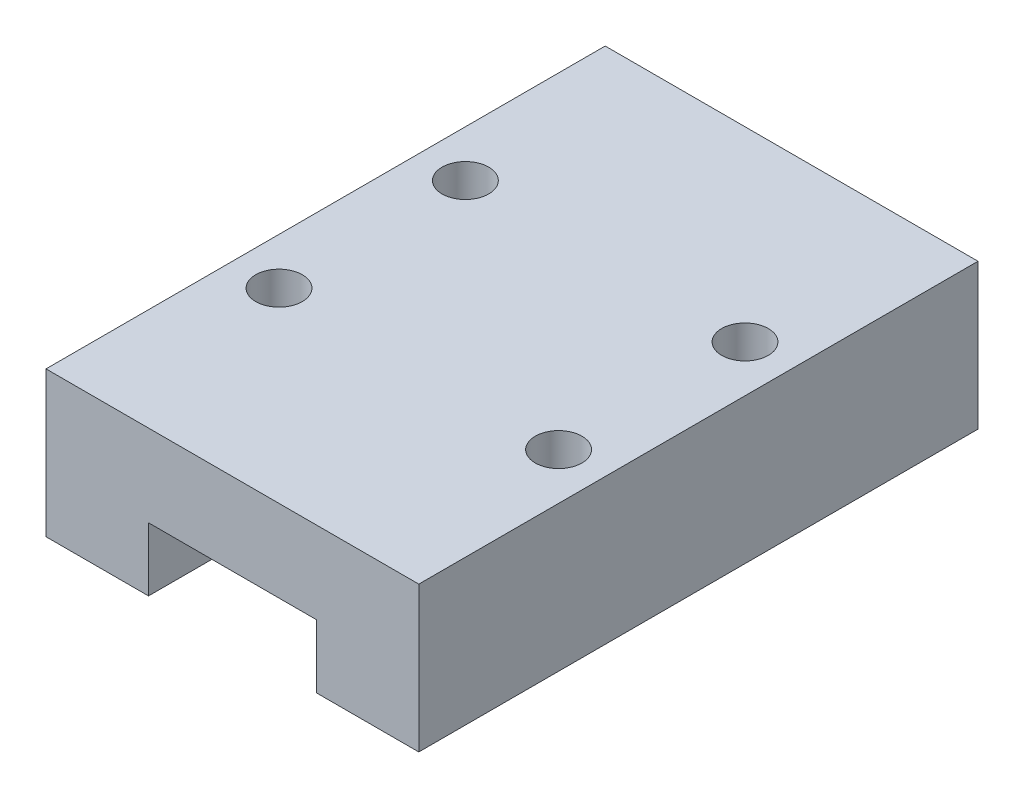
ISO-10303-21;
HEADER;
FILE_DESCRIPTION(('STEP AP214'),'2;1');
FILE_NAME('part.step','',(''),(''),'','','');
FILE_SCHEMA(('AUTOMOTIVE_DESIGN { 1 0 10303 214 1 1 1 1 }'));
ENDSEC;
DATA;
#1=APPLICATION_CONTEXT('core data for automotive mechanical design processes');
#2=APPLICATION_PROTOCOL_DEFINITION('international standard','automotive_design',2000,#1);
#3=PRODUCT_CONTEXT('',#1,'mechanical');
#4=PRODUCT('Part','Part','',(#3));
#5=PRODUCT_RELATED_PRODUCT_CATEGORY('part','',(#4));
#6=PRODUCT_DEFINITION_FORMATION('','',#4);
#7=PRODUCT_DEFINITION_CONTEXT('part definition',#1,'design');
#8=PRODUCT_DEFINITION('design','',#6,#7);
#9=PRODUCT_DEFINITION_SHAPE('','',#8);
#10=(LENGTH_UNIT() NAMED_UNIT(*) SI_UNIT(.MILLI.,.METRE.));
#11=(NAMED_UNIT(*) PLANE_ANGLE_UNIT() SI_UNIT($,.RADIAN.));
#12=(NAMED_UNIT(*) SI_UNIT($,.STERADIAN.) SOLID_ANGLE_UNIT());
#13=UNCERTAINTY_MEASURE_WITH_UNIT(LENGTH_MEASURE(1.E-05),#10,'distance_accuracy_value','');
#14=(GEOMETRIC_REPRESENTATION_CONTEXT(3) GLOBAL_UNCERTAINTY_ASSIGNED_CONTEXT((#13)) GLOBAL_UNIT_ASSIGNED_CONTEXT((#10,
#11,#12)) REPRESENTATION_CONTEXT('',''));
#15=CARTESIAN_POINT('',(0.,0.,0.));
#16=DIRECTION('',(0.,0.,1.));
#17=DIRECTION('',(1.,0.,0.));
#18=AXIS2_PLACEMENT_3D('',#15,#16,#17);
#19=CARTESIAN_POINT('',(5.5,0.,30.));
#20=DIRECTION('',(0.,1.,0.));
#21=DIRECTION('',(0.,0.,1.));
#22=AXIS2_PLACEMENT_3D('',#19,#20,#21);
#23=PLANE('',#22);
#24=DIRECTION('',(1.,0.,0.));
#25=VECTOR('',#24,1.);
#26=CARTESIAN_POINT('',(5.5,0.,0.));
#27=LINE('',#26,#25);
#28=CARTESIAN_POINT('',(0.,0.,0.));
#29=VERTEX_POINT('',#28);
#30=CARTESIAN_POINT('',(5.5,0.,0.));
#31=VERTEX_POINT('',#30);
#32=EDGE_CURVE('E128',#29,#31,#27,.T.);
#33=ORIENTED_EDGE('',*,*,#32,.T.);
#34=DIRECTION('',(0.,0.,-1.));
#35=VECTOR('',#34,1.);
#36=CARTESIAN_POINT('',(5.5,0.,30.));
#37=LINE('',#36,#35);
#38=CARTESIAN_POINT('',(5.5,0.,30.));
#39=VERTEX_POINT('',#38);
#40=EDGE_CURVE('E11',#39,#31,#37,.T.);
#41=ORIENTED_EDGE('',*,*,#40,.F.);
#42=DIRECTION('',(1.,0.,0.));
#43=VECTOR('',#42,1.);
#44=CARTESIAN_POINT('',(5.5,0.,30.));
#45=LINE('',#44,#43);
#46=CARTESIAN_POINT('',(0.,0.,30.));
#47=VERTEX_POINT('',#46);
#48=EDGE_CURVE('E143',#47,#39,#45,.T.);
#49=ORIENTED_EDGE('',*,*,#48,.F.);
#50=DIRECTION('',(0.,0.,-1.));
#51=VECTOR('',#50,1.);
#52=CARTESIAN_POINT('',(0.,0.,30.));
#53=LINE('',#52,#51);
#54=EDGE_CURVE('E124',#47,#29,#53,.T.);
#55=ORIENTED_EDGE('',*,*,#54,.T.);
#56=EDGE_LOOP('',(#33,#41,#49,#55));
#57=FACE_BOUND('',#56,.T.);
#58=ADVANCED_FACE('F32',(#57),#23,.F.);
#59=CARTESIAN_POINT('',(5.5,3.4,30.));
#60=DIRECTION('',(-1.,0.,0.));
#61=DIRECTION('',(0.,-1.,0.));
#62=AXIS2_PLACEMENT_3D('',#59,#60,#61);
#63=PLANE('',#62);
#64=DIRECTION('',(0.,1.,0.));
#65=VECTOR('',#64,1.);
#66=CARTESIAN_POINT('',(5.5,3.4,0.));
#67=LINE('',#66,#65);
#68=CARTESIAN_POINT('',(5.5,3.4,0.));
#69=VERTEX_POINT('',#68);
#70=EDGE_CURVE('E131',#31,#69,#67,.T.);
#71=ORIENTED_EDGE('',*,*,#70,.T.);
#72=DIRECTION('',(0.,0.,-1.));
#73=VECTOR('',#72,1.);
#74=CARTESIAN_POINT('',(5.5,3.4,30.));
#75=LINE('',#74,#73);
#76=CARTESIAN_POINT('',(5.5,3.4,30.));
#77=VERTEX_POINT('',#76);
#78=EDGE_CURVE('E40',#77,#69,#75,.T.);
#79=ORIENTED_EDGE('',*,*,#78,.F.);
#80=DIRECTION('',(0.,1.,0.));
#81=VECTOR('',#80,1.);
#82=CARTESIAN_POINT('',(5.5,3.4,30.));
#83=LINE('',#82,#81);
#84=EDGE_CURVE('E91',#39,#77,#83,.T.);
#85=ORIENTED_EDGE('',*,*,#84,.F.);
#86=ORIENTED_EDGE('',*,*,#40,.T.);
#87=EDGE_LOOP('',(#71,#79,#85,#86));
#88=FACE_BOUND('',#87,.T.);
#89=ADVANCED_FACE('F235',(#88),#63,.F.);
#90=CARTESIAN_POINT('',(14.5,3.4,30.));
#91=DIRECTION('',(0.,1.,0.));
#92=DIRECTION('',(-1.,0.,0.));
#93=AXIS2_PLACEMENT_3D('',#90,#91,#92);
#94=PLANE('',#93);
#95=DIRECTION('',(1.,0.,0.));
#96=VECTOR('',#95,1.);
#97=CARTESIAN_POINT('',(14.5,3.4,0.));
#98=LINE('',#97,#96);
#99=CARTESIAN_POINT('',(14.5,3.4,0.));
#100=VERTEX_POINT('',#99);
#101=EDGE_CURVE('E134',#69,#100,#98,.T.);
#102=ORIENTED_EDGE('',*,*,#101,.T.);
#103=DIRECTION('',(0.,0.,-1.));
#104=VECTOR('',#103,1.);
#105=CARTESIAN_POINT('',(14.5,3.4,30.));
#106=LINE('',#105,#104);
#107=CARTESIAN_POINT('',(14.5,3.4,30.));
#108=VERTEX_POINT('',#107);
#109=EDGE_CURVE('E150',#108,#100,#106,.T.);
#110=ORIENTED_EDGE('',*,*,#109,.F.);
#111=DIRECTION('',(1.,0.,0.));
#112=VECTOR('',#111,1.);
#113=CARTESIAN_POINT('',(14.5,3.4,30.));
#114=LINE('',#113,#112);
#115=EDGE_CURVE('E158',#77,#108,#114,.T.);
#116=ORIENTED_EDGE('',*,*,#115,.F.);
#117=ORIENTED_EDGE('',*,*,#78,.T.);
#118=EDGE_LOOP('',(#102,#110,#116,#117));
#119=FACE_BOUND('',#118,.T.);
#120=ADVANCED_FACE('F156',(#119),#94,.F.);
#121=CARTESIAN_POINT('',(14.5,0.,30.));
#122=DIRECTION('',(1.,0.,0.));
#123=DIRECTION('',(0.,1.,0.));
#124=AXIS2_PLACEMENT_3D('',#121,#122,#123);
#125=PLANE('',#124);
#126=DIRECTION('',(0.,-1.,0.));
#127=VECTOR('',#126,1.);
#128=CARTESIAN_POINT('',(14.5,0.,0.));
#129=LINE('',#128,#127);
#130=CARTESIAN_POINT('',(14.5,0.,0.));
#131=VERTEX_POINT('',#130);
#132=EDGE_CURVE('E136',#100,#131,#129,.T.);
#133=ORIENTED_EDGE('',*,*,#132,.T.);
#134=DIRECTION('',(0.,0.,-1.));
#135=VECTOR('',#134,1.);
#136=CARTESIAN_POINT('',(14.5,0.,30.));
#137=LINE('',#136,#135);
#138=CARTESIAN_POINT('',(14.5,0.,30.));
#139=VERTEX_POINT('',#138);
#140=EDGE_CURVE('E147',#139,#131,#137,.T.);
#141=ORIENTED_EDGE('',*,*,#140,.F.);
#142=DIRECTION('',(0.,-1.,0.));
#143=VECTOR('',#142,1.);
#144=CARTESIAN_POINT('',(14.5,0.,30.));
#145=LINE('',#144,#143);
#146=EDGE_CURVE('E170',#108,#139,#145,.T.);
#147=ORIENTED_EDGE('',*,*,#146,.F.);
#148=ORIENTED_EDGE('',*,*,#109,.T.);
#149=EDGE_LOOP('',(#133,#141,#147,#148));
#150=FACE_BOUND('',#149,.T.);
#151=ADVANCED_FACE('F166',(#150),#125,.F.);
#152=CARTESIAN_POINT('',(20.,0.,30.));
#153=DIRECTION('',(0.,1.,0.));
#154=DIRECTION('',(-1.,0.,0.));
#155=AXIS2_PLACEMENT_3D('',#152,#153,#154);
#156=PLANE('',#155);
#157=DIRECTION('',(1.,0.,0.));
#158=VECTOR('',#157,1.);
#159=CARTESIAN_POINT('',(20.,0.,0.));
#160=LINE('',#159,#158);
#161=CARTESIAN_POINT('',(20.,0.,0.));
#162=VERTEX_POINT('',#161);
#163=EDGE_CURVE('E138',#131,#162,#160,.T.);
#164=ORIENTED_EDGE('',*,*,#163,.T.);
#165=DIRECTION('',(0.,0.,-1.));
#166=VECTOR('',#165,1.);
#167=CARTESIAN_POINT('',(20.,0.,30.));
#168=LINE('',#167,#166);
#169=CARTESIAN_POINT('',(20.,0.,30.));
#170=VERTEX_POINT('',#169);
#171=EDGE_CURVE('E119',#170,#162,#168,.T.);
#172=ORIENTED_EDGE('',*,*,#171,.F.);
#173=DIRECTION('',(1.,0.,0.));
#174=VECTOR('',#173,1.);
#175=CARTESIAN_POINT('',(20.,0.,30.));
#176=LINE('',#175,#174);
#177=EDGE_CURVE('E110',#139,#170,#176,.T.);
#178=ORIENTED_EDGE('',*,*,#177,.F.);
#179=ORIENTED_EDGE('',*,*,#140,.T.);
#180=EDGE_LOOP('',(#164,#172,#178,#179));
#181=FACE_BOUND('',#180,.T.);
#182=ADVANCED_FACE('F169',(#181),#156,.F.);
#183=CARTESIAN_POINT('',(20.,7.8,30.));
#184=DIRECTION('',(-1.,0.,0.));
#185=DIRECTION('',(0.,0.,1.));
#186=AXIS2_PLACEMENT_3D('',#183,#184,#185);
#187=PLANE('',#186);
#188=DIRECTION('',(0.,1.,0.));
#189=VECTOR('',#188,1.);
#190=CARTESIAN_POINT('',(20.,7.8,0.));
#191=LINE('',#190,#189);
#192=CARTESIAN_POINT('',(20.,7.8,0.));
#193=VERTEX_POINT('',#192);
#194=EDGE_CURVE('E118',#162,#193,#191,.T.);
#195=ORIENTED_EDGE('',*,*,#194,.T.);
#196=DIRECTION('',(0.,0.,-1.));
#197=VECTOR('',#196,1.);
#198=CARTESIAN_POINT('',(20.,7.8,30.));
#199=LINE('',#198,#197);
#200=CARTESIAN_POINT('',(20.,7.8,30.));
#201=VERTEX_POINT('',#200);
#202=EDGE_CURVE('E115',#201,#193,#199,.T.);
#203=ORIENTED_EDGE('',*,*,#202,.F.);
#204=DIRECTION('',(0.,1.,0.));
#205=VECTOR('',#204,1.);
#206=CARTESIAN_POINT('',(20.,7.8,30.));
#207=LINE('',#206,#205);
#208=EDGE_CURVE('E104',#170,#201,#207,.T.);
#209=ORIENTED_EDGE('',*,*,#208,.F.);
#210=ORIENTED_EDGE('',*,*,#171,.T.);
#211=EDGE_LOOP('',(#195,#203,#209,#210));
#212=FACE_BOUND('',#211,.T.);
#213=ADVANCED_FACE('F116',(#212),#187,.F.);
#214=CARTESIAN_POINT('',(0.,7.8,30.));
#215=DIRECTION('',(0.,-1.,0.));
#216=DIRECTION('',(0.,0.,-1.));
#217=AXIS2_PLACEMENT_3D('',#214,#215,#216);
#218=PLANE('',#217);
#219=CARTESIAN_POINT('',(17.5,7.8,10.));
#220=DIRECTION('',(0.,1.,0.));
#221=DIRECTION('',(0.,0.,1.));
#222=AXIS2_PLACEMENT_3D('',#219,#220,#221);
#223=CIRCLE('',#222,1.25);
#224=CARTESIAN_POINT('',(17.5,7.8,11.25));
#225=VERTEX_POINT('',#224);
#226=EDGE_CURVE('E194',#225,#225,#223,.T.);
#227=ORIENTED_EDGE('',*,*,#226,.F.);
#228=EDGE_LOOP('',(#227));
#229=FACE_BOUND('',#228,.T.);
#230=CARTESIAN_POINT('',(17.5,7.8,20.));
#231=DIRECTION('',(0.,1.,0.));
#232=DIRECTION('',(0.,0.,1.));
#233=AXIS2_PLACEMENT_3D('',#230,#231,#232);
#234=CIRCLE('',#233,1.25);
#235=CARTESIAN_POINT('',(17.5,7.8,21.25));
#236=VERTEX_POINT('',#235);
#237=EDGE_CURVE('E188',#236,#236,#234,.T.);
#238=ORIENTED_EDGE('',*,*,#237,.F.);
#239=EDGE_LOOP('',(#238));
#240=FACE_BOUND('',#239,.T.);
#241=CARTESIAN_POINT('',(2.5,7.8,20.));
#242=DIRECTION('',(0.,1.,0.));
#243=DIRECTION('',(0.,0.,1.));
#244=AXIS2_PLACEMENT_3D('',#241,#242,#243);
#245=CIRCLE('',#244,1.25);
#246=CARTESIAN_POINT('',(2.5,7.8,21.25));
#247=VERTEX_POINT('',#246);
#248=EDGE_CURVE('E182',#247,#247,#245,.T.);
#249=ORIENTED_EDGE('',*,*,#248,.F.);
#250=EDGE_LOOP('',(#249));
#251=FACE_BOUND('',#250,.T.);
#252=CARTESIAN_POINT('',(2.5,7.8,10.));
#253=DIRECTION('',(0.,1.,0.));
#254=DIRECTION('',(0.,0.,1.));
#255=AXIS2_PLACEMENT_3D('',#252,#253,#254);
#256=CIRCLE('',#255,1.25);
#257=CARTESIAN_POINT('',(2.5,7.8,11.25));
#258=VERTEX_POINT('',#257);
#259=EDGE_CURVE('E176',#258,#258,#256,.T.);
#260=ORIENTED_EDGE('',*,*,#259,.F.);
#261=EDGE_LOOP('',(#260));
#262=FACE_BOUND('',#261,.T.);
#263=DIRECTION('',(-1.,0.,0.));
#264=VECTOR('',#263,1.);
#265=CARTESIAN_POINT('',(0.,7.8,0.));
#266=LINE('',#265,#264);
#267=CARTESIAN_POINT('',(0.,7.8,0.));
#268=VERTEX_POINT('',#267);
#269=EDGE_CURVE('E77',#193,#268,#266,.T.);
#270=ORIENTED_EDGE('',*,*,#269,.T.);
#271=DIRECTION('',(0.,0.,-1.));
#272=VECTOR('',#271,1.);
#273=CARTESIAN_POINT('',(0.,7.8,30.));
#274=LINE('',#273,#272);
#275=CARTESIAN_POINT('',(0.,7.8,30.));
#276=VERTEX_POINT('',#275);
#277=EDGE_CURVE('E120',#276,#268,#274,.T.);
#278=ORIENTED_EDGE('',*,*,#277,.F.);
#279=DIRECTION('',(-1.,0.,0.));
#280=VECTOR('',#279,1.);
#281=CARTESIAN_POINT('',(0.,7.8,30.));
#282=LINE('',#281,#280);
#283=EDGE_CURVE('E108',#201,#276,#282,.T.);
#284=ORIENTED_EDGE('',*,*,#283,.F.);
#285=ORIENTED_EDGE('',*,*,#202,.T.);
#286=EDGE_LOOP('',(#270,#278,#284,#285));
#287=FACE_BOUND('',#286,.T.);
#288=ADVANCED_FACE('F122',(#229,#240,#251,#262,#287),#218,.F.);
#289=CARTESIAN_POINT('',(0.,0.,30.));
#290=DIRECTION('',(1.,0.,0.));
#291=DIRECTION('',(0.,0.,-1.));
#292=AXIS2_PLACEMENT_3D('',#289,#290,#291);
#293=PLANE('',#292);
#294=DIRECTION('',(0.,-1.,0.));
#295=VECTOR('',#294,1.);
#296=CARTESIAN_POINT('',(0.,0.,0.));
#297=LINE('',#296,#295);
#298=EDGE_CURVE('E83',#268,#29,#297,.T.);
#299=ORIENTED_EDGE('',*,*,#298,.T.);
#300=ORIENTED_EDGE('',*,*,#54,.F.);
#301=DIRECTION('',(0.,-1.,0.));
#302=VECTOR('',#301,1.);
#303=CARTESIAN_POINT('',(0.,0.,30.));
#304=LINE('',#303,#302);
#305=EDGE_CURVE('E48',#276,#47,#304,.T.);
#306=ORIENTED_EDGE('',*,*,#305,.F.);
#307=ORIENTED_EDGE('',*,*,#277,.T.);
#308=EDGE_LOOP('',(#299,#300,#306,#307));
#309=FACE_BOUND('',#308,.T.);
#310=ADVANCED_FACE('F211',(#309),#293,.F.);
#311=CARTESIAN_POINT('',(0.,0.,30.));
#312=DIRECTION('',(0.,0.,-1.));
#313=DIRECTION('',(-1.,0.,0.));
#314=AXIS2_PLACEMENT_3D('',#311,#312,#313);
#315=PLANE('',#314);
#316=ORIENTED_EDGE('',*,*,#48,.T.);
#317=ORIENTED_EDGE('',*,*,#84,.T.);
#318=ORIENTED_EDGE('',*,*,#115,.T.);
#319=ORIENTED_EDGE('',*,*,#146,.T.);
#320=ORIENTED_EDGE('',*,*,#177,.T.);
#321=ORIENTED_EDGE('',*,*,#208,.T.);
#322=ORIENTED_EDGE('',*,*,#283,.T.);
#323=ORIENTED_EDGE('',*,*,#305,.T.);
#324=EDGE_LOOP('',(#316,#317,#318,#319,#320,#321,#322,#323));
#325=FACE_BOUND('',#324,.T.);
#326=ADVANCED_FACE('F106',(#325),#315,.F.);
#327=CARTESIAN_POINT('',(0.,0.,0.));
#328=DIRECTION('',(0.,0.,-1.));
#329=DIRECTION('',(-1.,0.,0.));
#330=AXIS2_PLACEMENT_3D('',#327,#328,#329);
#331=PLANE('',#330);
#332=ORIENTED_EDGE('',*,*,#32,.F.);
#333=ORIENTED_EDGE('',*,*,#298,.F.);
#334=ORIENTED_EDGE('',*,*,#269,.F.);
#335=ORIENTED_EDGE('',*,*,#194,.F.);
#336=ORIENTED_EDGE('',*,*,#163,.F.);
#337=ORIENTED_EDGE('',*,*,#132,.F.);
#338=ORIENTED_EDGE('',*,*,#101,.F.);
#339=ORIENTED_EDGE('',*,*,#70,.F.);
#340=EDGE_LOOP('',(#332,#333,#334,#335,#336,#337,#338,#339));
#341=FACE_BOUND('',#340,.T.);
#342=ADVANCED_FACE('F162',(#341),#331,.T.);
#343=CARTESIAN_POINT('',(2.5,5.2,10.));
#344=DIRECTION('',(0.,1.,0.));
#345=DIRECTION('',(0.,0.,1.));
#346=AXIS2_PLACEMENT_3D('',#343,#344,#345);
#347=CYLINDRICAL_SURFACE('',#346,1.25);
#348=CARTESIAN_POINT('',(2.5,5.2,10.));
#349=DIRECTION('',(0.,1.,0.));
#350=DIRECTION('',(0.,0.,1.));
#351=AXIS2_PLACEMENT_3D('',#348,#349,#350);
#352=CIRCLE('',#351,1.25);
#353=CARTESIAN_POINT('',(2.5,5.2,11.25));
#354=VERTEX_POINT('',#353);
#355=EDGE_CURVE('E132',#354,#354,#352,.T.);
#356=ORIENTED_EDGE('',*,*,#355,.F.);
#357=EDGE_LOOP('',(#356));
#358=FACE_BOUND('',#357,.T.);
#359=ORIENTED_EDGE('',*,*,#259,.T.);
#360=EDGE_LOOP('',(#359));
#361=FACE_BOUND('',#360,.T.);
#362=ADVANCED_FACE('F219',(#358,#361),#347,.F.);
#363=CARTESIAN_POINT('',(2.5,5.2,10.));
#364=DIRECTION('',(0.,1.,0.));
#365=DIRECTION('',(0.,0.,1.));
#366=AXIS2_PLACEMENT_3D('',#363,#364,#365);
#367=PLANE('',#366);
#368=ORIENTED_EDGE('',*,*,#355,.T.);
#369=EDGE_LOOP('',(#368));
#370=FACE_BOUND('',#369,.T.);
#371=ADVANCED_FACE('F221',(#370),#367,.T.);
#372=CARTESIAN_POINT('',(2.5,5.2,20.));
#373=DIRECTION('',(0.,1.,0.));
#374=DIRECTION('',(0.,0.,1.));
#375=AXIS2_PLACEMENT_3D('',#372,#373,#374);
#376=CYLINDRICAL_SURFACE('',#375,1.25);
#377=CARTESIAN_POINT('',(2.5,5.2,20.));
#378=DIRECTION('',(0.,1.,0.));
#379=DIRECTION('',(0.,0.,1.));
#380=AXIS2_PLACEMENT_3D('',#377,#378,#379);
#381=CIRCLE('',#380,1.25);
#382=CARTESIAN_POINT('',(2.5,5.2,21.25));
#383=VERTEX_POINT('',#382);
#384=EDGE_CURVE('E185',#383,#383,#381,.T.);
#385=ORIENTED_EDGE('',*,*,#384,.F.);
#386=EDGE_LOOP('',(#385));
#387=FACE_BOUND('',#386,.T.);
#388=ORIENTED_EDGE('',*,*,#248,.T.);
#389=EDGE_LOOP('',(#388));
#390=FACE_BOUND('',#389,.T.);
#391=ADVANCED_FACE('F228',(#387,#390),#376,.F.);
#392=CARTESIAN_POINT('',(2.5,5.2,20.));
#393=DIRECTION('',(0.,1.,0.));
#394=DIRECTION('',(0.,0.,1.));
#395=AXIS2_PLACEMENT_3D('',#392,#393,#394);
#396=PLANE('',#395);
#397=ORIENTED_EDGE('',*,*,#384,.T.);
#398=EDGE_LOOP('',(#397));
#399=FACE_BOUND('',#398,.T.);
#400=ADVANCED_FACE('F299',(#399),#396,.T.);
#401=CARTESIAN_POINT('',(17.5,5.2,20.));
#402=DIRECTION('',(0.,1.,0.));
#403=DIRECTION('',(0.,0.,1.));
#404=AXIS2_PLACEMENT_3D('',#401,#402,#403);
#405=CYLINDRICAL_SURFACE('',#404,1.25);
#406=CARTESIAN_POINT('',(17.5,5.2,20.));
#407=DIRECTION('',(0.,1.,0.));
#408=DIRECTION('',(0.,0.,1.));
#409=AXIS2_PLACEMENT_3D('',#406,#407,#408);
#410=CIRCLE('',#409,1.25);
#411=CARTESIAN_POINT('',(17.5,5.2,21.25));
#412=VERTEX_POINT('',#411);
#413=EDGE_CURVE('E191',#412,#412,#410,.T.);
#414=ORIENTED_EDGE('',*,*,#413,.F.);
#415=EDGE_LOOP('',(#414));
#416=FACE_BOUND('',#415,.T.);
#417=ORIENTED_EDGE('',*,*,#237,.T.);
#418=EDGE_LOOP('',(#417));
#419=FACE_BOUND('',#418,.T.);
#420=ADVANCED_FACE('F309',(#416,#419),#405,.F.);
#421=CARTESIAN_POINT('',(17.5,5.2,20.));
#422=DIRECTION('',(0.,1.,0.));
#423=DIRECTION('',(0.,0.,1.));
#424=AXIS2_PLACEMENT_3D('',#421,#422,#423);
#425=PLANE('',#424);
#426=ORIENTED_EDGE('',*,*,#413,.T.);
#427=EDGE_LOOP('',(#426));
#428=FACE_BOUND('',#427,.T.);
#429=ADVANCED_FACE('F205',(#428),#425,.T.);
#430=CARTESIAN_POINT('',(17.5,5.2,10.));
#431=DIRECTION('',(0.,1.,0.));
#432=DIRECTION('',(0.,0.,1.));
#433=AXIS2_PLACEMENT_3D('',#430,#431,#432);
#434=CYLINDRICAL_SURFACE('',#433,1.25);
#435=CARTESIAN_POINT('',(17.5,5.2,10.));
#436=DIRECTION('',(0.,1.,0.));
#437=DIRECTION('',(0.,0.,1.));
#438=AXIS2_PLACEMENT_3D('',#435,#436,#437);
#439=CIRCLE('',#438,1.25);
#440=CARTESIAN_POINT('',(17.5,5.2,11.25));
#441=VERTEX_POINT('',#440);
#442=EDGE_CURVE('E179',#441,#441,#439,.T.);
#443=ORIENTED_EDGE('',*,*,#442,.F.);
#444=EDGE_LOOP('',(#443));
#445=FACE_BOUND('',#444,.T.);
#446=ORIENTED_EDGE('',*,*,#226,.T.);
#447=EDGE_LOOP('',(#446));
#448=FACE_BOUND('',#447,.T.);
#449=ADVANCED_FACE('F202',(#445,#448),#434,.F.);
#450=CARTESIAN_POINT('',(17.5,5.2,10.));
#451=DIRECTION('',(0.,1.,0.));
#452=DIRECTION('',(0.,0.,1.));
#453=AXIS2_PLACEMENT_3D('',#450,#451,#452);
#454=PLANE('',#453);
#455=ORIENTED_EDGE('',*,*,#442,.T.);
#456=EDGE_LOOP('',(#455));
#457=FACE_BOUND('',#456,.T.);
#458=ADVANCED_FACE('F200',(#457),#454,.T.);
#459=CLOSED_SHELL('',(#58,#89,#120,#151,#182,#213,#288,#310,#326,#342,#362,#371,#391,#400,#420,
#429,#449,#458));
#460=MANIFOLD_SOLID_BREP('B2',#459);
#461=ADVANCED_BREP_SHAPE_REPRESENTATION('',(#18,#460),#14);
#462=SHAPE_DEFINITION_REPRESENTATION(#9,#461);
ENDSEC;
END-ISO-10303-21;
